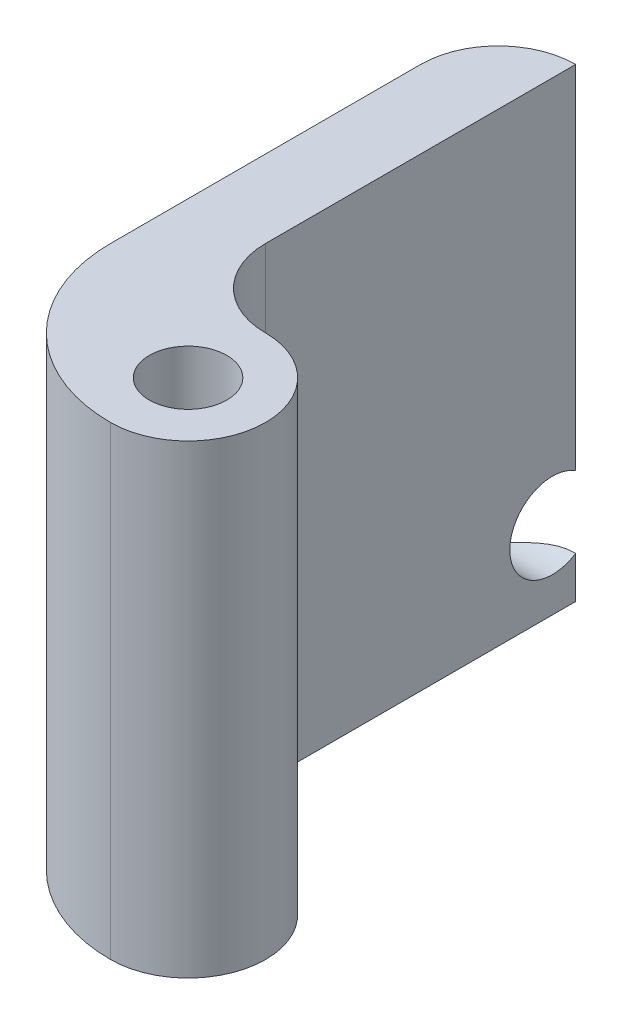
ISO-10303-21;
HEADER;
FILE_DESCRIPTION(('STEP AP214'),'2;1');
FILE_NAME('part.step','',(''),(''),'','','');
FILE_SCHEMA(('AUTOMOTIVE_DESIGN { 1 0 10303 214 1 1 1 1 }'));
ENDSEC;
DATA;
#1=APPLICATION_CONTEXT('core data for automotive mechanical design processes');
#2=APPLICATION_PROTOCOL_DEFINITION('international standard','automotive_design',2000,#1);
#3=PRODUCT_CONTEXT('',#1,'mechanical');
#4=PRODUCT('Part','Part','',(#3));
#5=PRODUCT_RELATED_PRODUCT_CATEGORY('part','',(#4));
#6=PRODUCT_DEFINITION_FORMATION('','',#4);
#7=PRODUCT_DEFINITION_CONTEXT('part definition',#1,'design');
#8=PRODUCT_DEFINITION('design','',#6,#7);
#9=PRODUCT_DEFINITION_SHAPE('','',#8);
#10=(LENGTH_UNIT() NAMED_UNIT(*) SI_UNIT(.MILLI.,.METRE.));
#11=(NAMED_UNIT(*) PLANE_ANGLE_UNIT() SI_UNIT($,.RADIAN.));
#12=(NAMED_UNIT(*) SI_UNIT($,.STERADIAN.) SOLID_ANGLE_UNIT());
#13=UNCERTAINTY_MEASURE_WITH_UNIT(LENGTH_MEASURE(1.E-05),#10,'distance_accuracy_value','');
#14=(GEOMETRIC_REPRESENTATION_CONTEXT(3) GLOBAL_UNCERTAINTY_ASSIGNED_CONTEXT((#13)) GLOBAL_UNIT_ASSIGNED_CONTEXT((#10,
#11,#12)) REPRESENTATION_CONTEXT('',''));
#15=CARTESIAN_POINT('',(0.,0.,0.));
#16=DIRECTION('',(0.,0.,1.));
#17=DIRECTION('',(1.,0.,0.));
#18=AXIS2_PLACEMENT_3D('',#15,#16,#17);
#19=CARTESIAN_POINT('',(0.,30.,-10.));
#20=DIRECTION('',(0.,-1.,0.));
#21=DIRECTION('',(0.,0.,-1.));
#22=AXIS2_PLACEMENT_3D('',#19,#20,#21);
#23=PLANE('',#22);
#24=DIRECTION('',(0.,0.,-1.));
#25=VECTOR('',#24,1.);
#26=CARTESIAN_POINT('',(-5.,30.,-30.));
#27=LINE('',#26,#25);
#28=CARTESIAN_POINT('',(-5.,30.,-10.));
#29=VERTEX_POINT('',#28);
#30=CARTESIAN_POINT('',(-5.,30.,-30.));
#31=VERTEX_POINT('',#30);
#32=EDGE_CURVE('E114',#29,#31,#27,.T.);
#33=ORIENTED_EDGE('',*,*,#32,.T.);
#34=CARTESIAN_POINT('',(-5.,30.,-25.));
#35=DIRECTION('',(0.,-1.,0.));
#36=DIRECTION('',(0.,0.,-1.));
#37=AXIS2_PLACEMENT_3D('',#34,#35,#36);
#38=CIRCLE('',#37,5.);
#39=CARTESIAN_POINT('',(-10.,30.,-25.));
#40=VERTEX_POINT('',#39);
#41=EDGE_CURVE('E49',#31,#40,#38,.F.);
#42=ORIENTED_EDGE('',*,*,#41,.T.);
#43=DIRECTION('',(0.,0.,1.));
#44=VECTOR('',#43,1.);
#45=CARTESIAN_POINT('',(-10.,30.,-5.00000000000001));
#46=LINE('',#45,#44);
#47=CARTESIAN_POINT('',(-10.,30.,-5.00000000000001));
#48=VERTEX_POINT('',#47);
#49=EDGE_CURVE('E141',#40,#48,#46,.T.);
#50=ORIENTED_EDGE('',*,*,#49,.T.);
#51=CARTESIAN_POINT('',(0.,30.,-5.00000000000001));
#52=DIRECTION('',(0.,1.,0.));
#53=DIRECTION('',(0.,0.,-1.));
#54=AXIS2_PLACEMENT_3D('',#51,#52,#53);
#55=CIRCLE('',#54,10.);
#56=CARTESIAN_POINT('',(0.,30.,4.99999999999999));
#57=VERTEX_POINT('',#56);
#58=EDGE_CURVE('E143',#48,#57,#55,.T.);
#59=ORIENTED_EDGE('',*,*,#58,.T.);
#60=CARTESIAN_POINT('',(0.,30.,0.));
#61=DIRECTION('',(0.,1.,0.));
#62=DIRECTION('',(0.,0.,1.));
#63=AXIS2_PLACEMENT_3D('',#60,#61,#62);
#64=CIRCLE('',#63,5.);
#65=CARTESIAN_POINT('',(0.,30.,-5.));
#66=VERTEX_POINT('',#65);
#67=EDGE_CURVE('E156',#57,#66,#64,.T.);
#68=ORIENTED_EDGE('',*,*,#67,.T.);
#69=CARTESIAN_POINT('',(0.,30.,-10.));
#70=DIRECTION('',(0.,-1.,0.));
#71=DIRECTION('',(0.,0.,-1.));
#72=AXIS2_PLACEMENT_3D('',#69,#70,#71);
#73=CIRCLE('',#72,5.);
#74=EDGE_CURVE('E154',#66,#29,#73,.T.);
#75=ORIENTED_EDGE('',*,*,#74,.T.);
#76=EDGE_LOOP('',(#33,#42,#50,#59,#68,#75));
#77=FACE_BOUND('',#76,.T.);
#78=CARTESIAN_POINT('',(0.,30.,0.));
#79=DIRECTION('',(0.,1.,0.));
#80=DIRECTION('',(0.,0.,1.));
#81=AXIS2_PLACEMENT_3D('',#78,#79,#80);
#82=CIRCLE('',#81,2.5);
#83=CARTESIAN_POINT('',(0.,30.,2.5));
#84=VERTEX_POINT('',#83);
#85=EDGE_CURVE('E152',#84,#84,#82,.T.);
#86=ORIENTED_EDGE('',*,*,#85,.F.);
#87=EDGE_LOOP('',(#86));
#88=FACE_BOUND('',#87,.T.);
#89=ADVANCED_FACE('F36',(#77,#88),#23,.F.);
#90=CARTESIAN_POINT('',(0.,0.,-10.));
#91=DIRECTION('',(0.,-1.,0.));
#92=DIRECTION('',(0.,0.,-1.));
#93=AXIS2_PLACEMENT_3D('',#90,#91,#92);
#94=PLANE('',#93);
#95=DIRECTION('',(0.,0.,1.));
#96=VECTOR('',#95,1.);
#97=CARTESIAN_POINT('',(-10.,0.,-5.00000000000001));
#98=LINE('',#97,#96);
#99=CARTESIAN_POINT('',(-10.,0.,-25.));
#100=VERTEX_POINT('',#99);
#101=CARTESIAN_POINT('',(-10.,0.,-5.00000000000001));
#102=VERTEX_POINT('',#101);
#103=EDGE_CURVE('E139',#100,#102,#98,.T.);
#104=ORIENTED_EDGE('',*,*,#103,.F.);
#105=CARTESIAN_POINT('',(-5.,0.,-25.));
#106=DIRECTION('',(0.,-1.,0.));
#107=DIRECTION('',(0.,0.,-1.));
#108=AXIS2_PLACEMENT_3D('',#105,#106,#107);
#109=CIRCLE('',#108,5.);
#110=CARTESIAN_POINT('',(-5.,0.,-30.));
#111=VERTEX_POINT('',#110);
#112=EDGE_CURVE('E130',#100,#111,#109,.T.);
#113=ORIENTED_EDGE('',*,*,#112,.T.);
#114=DIRECTION('',(0.,0.,-1.));
#115=VECTOR('',#114,1.);
#116=CARTESIAN_POINT('',(-5.,0.,-30.));
#117=LINE('',#116,#115);
#118=CARTESIAN_POINT('',(-5.,0.,-10.));
#119=VERTEX_POINT('',#118);
#120=EDGE_CURVE('E116',#119,#111,#117,.T.);
#121=ORIENTED_EDGE('',*,*,#120,.F.);
#122=CARTESIAN_POINT('',(0.,0.,-10.));
#123=DIRECTION('',(0.,-1.,0.));
#124=DIRECTION('',(0.,0.,-1.));
#125=AXIS2_PLACEMENT_3D('',#122,#123,#124);
#126=CIRCLE('',#125,5.);
#127=CARTESIAN_POINT('',(0.,0.,-5.));
#128=VERTEX_POINT('',#127);
#129=EDGE_CURVE('E142',#128,#119,#126,.T.);
#130=ORIENTED_EDGE('',*,*,#129,.F.);
#131=CARTESIAN_POINT('',(0.,0.,0.));
#132=DIRECTION('',(0.,1.,0.));
#133=DIRECTION('',(0.,0.,1.));
#134=AXIS2_PLACEMENT_3D('',#131,#132,#133);
#135=CIRCLE('',#134,5.);
#136=CARTESIAN_POINT('',(0.,0.,4.99999999999999));
#137=VERTEX_POINT('',#136);
#138=EDGE_CURVE('E145',#137,#128,#135,.T.);
#139=ORIENTED_EDGE('',*,*,#138,.F.);
#140=CARTESIAN_POINT('',(0.,0.,-5.00000000000001));
#141=DIRECTION('',(0.,1.,0.));
#142=DIRECTION('',(0.,0.,-1.));
#143=AXIS2_PLACEMENT_3D('',#140,#141,#142);
#144=CIRCLE('',#143,10.);
#145=EDGE_CURVE('E147',#102,#137,#144,.T.);
#146=ORIENTED_EDGE('',*,*,#145,.F.);
#147=EDGE_LOOP('',(#104,#113,#121,#130,#139,#146));
#148=FACE_BOUND('',#147,.T.);
#149=CARTESIAN_POINT('',(0.,0.,0.));
#150=DIRECTION('',(0.,1.,0.));
#151=DIRECTION('',(0.,0.,1.));
#152=AXIS2_PLACEMENT_3D('',#149,#150,#151);
#153=CIRCLE('',#152,2.5);
#154=CARTESIAN_POINT('',(0.,0.,2.5));
#155=VERTEX_POINT('',#154);
#156=EDGE_CURVE('E106',#155,#155,#153,.T.);
#157=ORIENTED_EDGE('',*,*,#156,.T.);
#158=EDGE_LOOP('',(#157));
#159=FACE_BOUND('',#158,.T.);
#160=ADVANCED_FACE('F135',(#148,#159),#94,.T.);
#161=CARTESIAN_POINT('',(-10.,30.,-5.00000000000001));
#162=DIRECTION('',(1.,0.,0.));
#163=DIRECTION('',(0.,0.,-1.));
#164=AXIS2_PLACEMENT_3D('',#161,#162,#163);
#165=PLANE('',#164);
#166=ORIENTED_EDGE('',*,*,#49,.F.);
#167=DIRECTION('',(0.,-1.,0.));
#168=VECTOR('',#167,1.);
#169=CARTESIAN_POINT('',(-10.,30.,-25.));
#170=LINE('',#169,#168);
#171=EDGE_CURVE('E127',#40,#100,#170,.T.);
#172=ORIENTED_EDGE('',*,*,#171,.T.);
#173=ORIENTED_EDGE('',*,*,#103,.T.);
#174=DIRECTION('',(0.,-1.,0.));
#175=VECTOR('',#174,1.);
#176=CARTESIAN_POINT('',(-10.,30.,-5.00000000000001));
#177=LINE('',#176,#175);
#178=EDGE_CURVE('E124',#48,#102,#177,.T.);
#179=ORIENTED_EDGE('',*,*,#178,.F.);
#180=EDGE_LOOP('',(#166,#172,#173,#179));
#181=FACE_BOUND('',#180,.T.);
#182=ADVANCED_FACE('F172',(#181),#165,.F.);
#183=CARTESIAN_POINT('',(0.,30.,-5.00000000000001));
#184=DIRECTION('',(0.,-1.,0.));
#185=DIRECTION('',(0.,0.,-1.));
#186=AXIS2_PLACEMENT_3D('',#183,#184,#185);
#187=CYLINDRICAL_SURFACE('',#186,10.);
#188=ORIENTED_EDGE('',*,*,#145,.T.);
#189=DIRECTION('',(0.,-1.,0.));
#190=VECTOR('',#189,1.);
#191=CARTESIAN_POINT('',(0.,30.,4.99999999999999));
#192=LINE('',#191,#190);
#193=EDGE_CURVE('E121',#57,#137,#192,.T.);
#194=ORIENTED_EDGE('',*,*,#193,.F.);
#195=ORIENTED_EDGE('',*,*,#58,.F.);
#196=ORIENTED_EDGE('',*,*,#178,.T.);
#197=EDGE_LOOP('',(#188,#194,#195,#196));
#198=FACE_BOUND('',#197,.T.);
#199=ADVANCED_FACE('F184',(#198),#187,.T.);
#200=CARTESIAN_POINT('',(0.,30.,0.));
#201=DIRECTION('',(0.,-1.,0.));
#202=DIRECTION('',(0.,0.,-1.));
#203=AXIS2_PLACEMENT_3D('',#200,#201,#202);
#204=CYLINDRICAL_SURFACE('',#203,5.);
#205=ORIENTED_EDGE('',*,*,#138,.T.);
#206=DIRECTION('',(0.,-1.,0.));
#207=VECTOR('',#206,1.);
#208=CARTESIAN_POINT('',(0.,30.,-5.));
#209=LINE('',#208,#207);
#210=EDGE_CURVE('E112',#66,#128,#209,.T.);
#211=ORIENTED_EDGE('',*,*,#210,.F.);
#212=ORIENTED_EDGE('',*,*,#67,.F.);
#213=ORIENTED_EDGE('',*,*,#193,.T.);
#214=EDGE_LOOP('',(#205,#211,#212,#213));
#215=FACE_BOUND('',#214,.T.);
#216=ADVANCED_FACE('F181',(#215),#204,.T.);
#217=CARTESIAN_POINT('',(0.,30.,-10.));
#218=DIRECTION('',(0.,-1.,0.));
#219=DIRECTION('',(0.,0.,-1.));
#220=AXIS2_PLACEMENT_3D('',#217,#218,#219);
#221=CYLINDRICAL_SURFACE('',#220,5.);
#222=ORIENTED_EDGE('',*,*,#129,.T.);
#223=DIRECTION('',(0.,-1.,0.));
#224=VECTOR('',#223,1.);
#225=CARTESIAN_POINT('',(-5.,30.,-10.));
#226=LINE('',#225,#224);
#227=EDGE_CURVE('E109',#29,#119,#226,.T.);
#228=ORIENTED_EDGE('',*,*,#227,.F.);
#229=ORIENTED_EDGE('',*,*,#74,.F.);
#230=ORIENTED_EDGE('',*,*,#210,.T.);
#231=EDGE_LOOP('',(#222,#228,#229,#230));
#232=FACE_BOUND('',#231,.T.);
#233=ADVANCED_FACE('F178',(#232),#221,.F.);
#234=CARTESIAN_POINT('',(-5.,30.,-30.));
#235=DIRECTION('',(-1.,0.,0.));
#236=DIRECTION('',(0.,0.,1.));
#237=AXIS2_PLACEMENT_3D('',#234,#235,#236);
#238=PLANE('',#237);
#239=DIRECTION('',(0.,-1.,0.));
#240=VECTOR('',#239,1.);
#241=CARTESIAN_POINT('',(-5.,30.,-30.));
#242=LINE('',#241,#240);
#243=CARTESIAN_POINT('',(-5.,2.69511388567689,-30.));
#244=VERTEX_POINT('',#243);
#245=EDGE_CURVE('E105',#244,#111,#242,.T.);
#246=ORIENTED_EDGE('',*,*,#245,.F.);
#247=CARTESIAN_POINT('',(-5.,5.00000000000006,-28.4999999999999));
#248=DIRECTION('',(-1.,0.,0.));
#249=DIRECTION('',(0.,0.,1.));
#250=AXIS2_PLACEMENT_3D('',#247,#248,#249);
#251=CIRCLE('',#250,2.75000000000004);
#252=CARTESIAN_POINT('',(-5.,7.30488611432323,-30.));
#253=VERTEX_POINT('',#252);
#254=EDGE_CURVE('E54',#244,#253,#251,.T.);
#255=ORIENTED_EDGE('',*,*,#254,.T.);
#256=EDGE_CURVE('E103',#31,#253,#242,.T.);
#257=ORIENTED_EDGE('',*,*,#256,.F.);
#258=ORIENTED_EDGE('',*,*,#32,.F.);
#259=ORIENTED_EDGE('',*,*,#227,.T.);
#260=ORIENTED_EDGE('',*,*,#120,.T.);
#261=EDGE_LOOP('',(#246,#255,#257,#258,#259,#260));
#262=FACE_BOUND('',#261,.T.);
#263=ADVANCED_FACE('F101',(#262),#238,.F.);
#264=CARTESIAN_POINT('',(0.,30.,0.));
#265=DIRECTION('',(0.,-1.,0.));
#266=DIRECTION('',(0.,0.,-1.));
#267=AXIS2_PLACEMENT_3D('',#264,#265,#266);
#268=CYLINDRICAL_SURFACE('',#267,2.5);
#269=ORIENTED_EDGE('',*,*,#85,.T.);
#270=EDGE_LOOP('',(#269));
#271=FACE_BOUND('',#270,.T.);
#272=ORIENTED_EDGE('',*,*,#156,.F.);
#273=EDGE_LOOP('',(#272));
#274=FACE_BOUND('',#273,.T.);
#275=ADVANCED_FACE('F164',(#271,#274),#268,.F.);
#276=CARTESIAN_POINT('',(-5.,30.,-25.));
#277=DIRECTION('',(0.,-1.,0.));
#278=DIRECTION('',(0.,0.,-1.));
#279=AXIS2_PLACEMENT_3D('',#276,#277,#278);
#280=CYLINDRICAL_SURFACE('',#279,5.);
#281=CARTESIAN_POINT('',(-5.,7.30488611432323,-30.));
#282=CARTESIAN_POINT('',(-4.88350079837599,7.30488438008612,-30.0000005848881));
#283=CARTESIAN_POINT('',(-4.76700903117045,7.30755376280442,-29.9959241485639));
#284=CARTESIAN_POINT('',(-4.53483204772067,7.31800684969586,-29.9796747868834));
#285=CARTESIAN_POINT('',(-4.41914679595078,7.32579032714486,-29.9675022204542));
#286=CARTESIAN_POINT('',(-4.18913322244802,7.3458727404168,-29.93518001819));
#287=CARTESIAN_POINT('',(-4.07480702488851,7.35817797655174,-29.9150192490528));
#288=CARTESIAN_POINT('',(-3.84823786206934,7.38638061181478,-29.8669160129058));
#289=CARTESIAN_POINT('',(-3.73599577735438,7.40227949350813,-29.8389703331073));
#290=CARTESIAN_POINT('',(-3.38865247107774,7.45596952601285,-29.7396163470483));
#291=CARTESIAN_POINT('',(-3.15795579994245,7.49820694558018,-29.6547660862543));
#292=CARTESIAN_POINT('',(-2.71145302390179,7.58218412325666,-29.4522760550566));
#293=CARTESIAN_POINT('',(-2.49564876297512,7.62392381921026,-29.334632233209));
#294=CARTESIAN_POINT('',(-2.10607961348294,7.69021560269432,-29.0831783344733));
#295=CARTESIAN_POINT('',(-1.93034824820065,7.71620548506325,-28.952859671417));
#296=CARTESIAN_POINT('',(-1.68007982976549,7.74040336113016,-28.7403385513366));
#297=CARTESIAN_POINT('',(-1.59890770478772,7.74600552698223,-28.6666898975731));
#298=CARTESIAN_POINT('',(-1.44147316087782,7.75102240406644,-28.5140970731862));
#299=CARTESIAN_POINT('',(-1.36520929038089,7.75043895316817,-28.4351544824234));
#300=CARTESIAN_POINT('',(-1.23573340242434,7.74282337548528,-28.2920013577872));
#301=CARTESIAN_POINT('',(-1.18135568259559,7.73735946215073,-28.2287575079397));
#302=CARTESIAN_POINT('',(-1.07611604866416,7.72152709757494,-28.1000066692595));
#303=CARTESIAN_POINT('',(-1.02525323848202,7.71115990168635,-28.0345002636698));
#304=CARTESIAN_POINT('',(-0.927330223383593,7.68499058352882,-27.9017516735269));
#305=CARTESIAN_POINT('',(-0.880269646745174,7.66918899334472,-27.8345096595041));
#306=CARTESIAN_POINT('',(-0.790234727850116,7.63169263625654,-27.6989795317148));
#307=CARTESIAN_POINT('',(-0.747258354832398,7.61000081902669,-27.6306919576457));
#308=CARTESIAN_POINT('',(-0.665233485896505,7.56014215233736,-27.493242474214));
#309=CARTESIAN_POINT('',(-0.626221521956598,7.53192177993822,-27.4240780692426));
#310=CARTESIAN_POINT('',(-0.552702452059029,7.46888777327927,-27.2864014971924));
#311=CARTESIAN_POINT('',(-0.518193215360937,7.43407727679335,-27.2178890359404));
#312=CARTESIAN_POINT('',(-0.453690499054868,7.35778630162598,-27.0824733131907));
#313=CARTESIAN_POINT('',(-0.423696655308705,7.31630636135197,-27.0155699222974));
#314=CARTESIAN_POINT('',(-0.368131502606649,7.22678281402705,-26.8843751193246));
#315=CARTESIAN_POINT('',(-0.342559684333782,7.17873996401684,-26.8200834070925));
#316=CARTESIAN_POINT('',(-0.298555295483646,7.08276053977785,-26.7028897604728));
#317=CARTESIAN_POINT('',(-0.279629933342807,7.03556047990159,-26.6495683195694));
#318=CARTESIAN_POINT('',(-0.244783652637904,6.93661909010059,-26.5462511548494));
#319=CARTESIAN_POINT('',(-0.22886374120248,6.88487624636532,-26.4962565494788));
#320=CARTESIAN_POINT('',(-0.185255350132327,6.72335885062642,-26.3521454799332));
#321=CARTESIAN_POINT('',(-0.161673897925519,6.60719515190793,-26.2637784392464));
#322=CARTESIAN_POINT('',(-0.123561702466859,6.36361389931764,-26.1075825983506));
#323=CARTESIAN_POINT('',(-0.108875285842824,6.23643730694591,-26.0394118922059));
#324=CARTESIAN_POINT('',(-0.085700937372615,5.97249669366126,-25.9236633932721));
#325=CARTESIAN_POINT('',(-0.0772136244224668,5.8357317169723,-25.876087656803));
#326=CARTESIAN_POINT('',(-0.064529334471971,5.55115292670175,-25.8016403871459));
#327=CARTESIAN_POINT('',(-0.0604995324806083,5.40311819700328,-25.7755843482168));
#328=CARTESIAN_POINT('',(-0.0562336979441752,5.10471686619894,-25.7479109681111));
#329=CARTESIAN_POINT('',(-0.0559982227697784,4.95434992574837,-25.7462972174061));
#330=CARTESIAN_POINT('',(-0.0592851180210162,4.65262815885907,-25.7677624589996));
#331=CARTESIAN_POINT('',(-0.06287686011923,4.50130624190038,-25.7912973140352));
#332=CARTESIAN_POINT('',(-0.0749175835935172,4.20481762830984,-25.8630610443448));
#333=CARTESIAN_POINT('',(-0.0833668271578029,4.05965126438393,-25.9112912525582));
#334=CARTESIAN_POINT('',(-0.107000816362275,3.78026003549509,-26.0306441792242));
#335=CARTESIAN_POINT('',(-0.122160495151609,3.64599663102872,-26.1016814331216));
#336=CARTESIAN_POINT('',(-0.161713056877911,3.39191797443834,-26.2640926197801));
#337=CARTESIAN_POINT('',(-0.186102869852574,3.27209793587219,-26.3554597866103));
#338=CARTESIAN_POINT('',(-0.245836268853506,3.05372394892031,-26.5518108325244));
#339=CARTESIAN_POINT('',(-0.280842425109099,2.95465491137525,-26.65632412098));
#340=CARTESIAN_POINT('',(-0.363891561036861,2.77605039178931,-26.8762383818068));
#341=CARTESIAN_POINT('',(-0.411930366224652,2.69650867047294,-26.9916358601583));
#342=CARTESIAN_POINT('',(-0.520403247999521,2.55994885180776,-27.2246942757542));
#343=CARTESIAN_POINT('',(-0.580458565362052,2.50236962702536,-27.3422048043939));
#344=CARTESIAN_POINT('',(-0.713489515790163,2.40618025049447,-27.5776183620988));
#345=CARTESIAN_POINT('',(-0.786467987654886,2.36757427360395,-27.6955214718063));
#346=CARTESIAN_POINT('',(-0.949033300909887,2.30575191891791,-27.9345880178184));
#347=CARTESIAN_POINT('',(-1.03935510175399,2.28360091247397,-28.0555209813898));
#348=CARTESIAN_POINT('',(-1.23164184273991,2.25550768554355,-28.2897537813862));
#349=CARTESIAN_POINT('',(-1.33361439699102,2.24957612879862,-28.4030485482429));
#350=CARTESIAN_POINT('',(-1.52400590605913,2.25037327616506,-28.596058678965));
#351=CARTESIAN_POINT('',(-1.61052000031012,2.25461957374823,-28.6777032621456));
#352=CARTESIAN_POINT('',(-1.78885854998942,2.26927383849586,-28.8344067269335));
#353=CARTESIAN_POINT('',(-1.88068549289879,2.27968471333388,-28.9094624815635));
#354=CARTESIAN_POINT('',(-2.16351777078853,2.31786058019475,-29.1243725640683));
#355=CARTESIAN_POINT('',(-2.3616506778843,2.35255957826099,-29.2537437375979));
#356=CARTESIAN_POINT('',(-2.77918136971558,2.42994824595884,-29.4863105727803));
#357=CARTESIAN_POINT('',(-2.9990451962319,2.47285049247009,-29.5885809089253));
#358=CARTESIAN_POINT('',(-3.45204792582144,2.55403858094329,-29.7604971327359));
#359=CARTESIAN_POINT('',(-3.68517735853006,2.5923276568706,-29.8301659749658));
#360=CARTESIAN_POINT('',(-4.06173418950196,2.64065742035693,-29.91323420193));
#361=CARTESIAN_POINT('',(-4.20206895908017,2.65582104901825,-29.9379840007137));
#362=CARTESIAN_POINT('',(-4.48495493492345,2.67921101792717,-29.9754459680692));
#363=CARTESIAN_POINT('',(-4.62750609827472,2.687437492322,-29.9881583694148));
#364=CARTESIAN_POINT('',(-4.91326434248702,2.69594149045814,-30.0012914766664));
#365=CARTESIAN_POINT('',(-5.05647058971365,2.69622724968873,-30.0017249173599));
#366=CARTESIAN_POINT('',(-5.34217543121717,2.68883706675379,-29.9903259907439));
#367=CARTESIAN_POINT('',(-5.484674069151,2.68116162205541,-29.9784943898328));
#368=CARTESIAN_POINT('',(-5.74568578286879,2.66051602932616,-29.945552053852));
#369=CARTESIAN_POINT('',(-5.86450099456769,2.64854795146736,-29.9261587580892));
#370=CARTESIAN_POINT('',(-6.09998535621392,2.62057654686118,-29.8789824132471));
#371=CARTESIAN_POINT('',(-6.21665359483854,2.60457154710889,-29.8511958848496));
#372=CARTESIAN_POINT('',(-6.56304395448154,2.55221119743616,-29.7554496136479));
#373=CARTESIAN_POINT('',(-6.78885250479127,2.51153953051289,-29.6751415725507));
#374=CARTESIAN_POINT('',(-7.13016470892409,2.44770704283925,-29.5255237325058));
#375=CARTESIAN_POINT('',(-7.25055851974997,2.42470048144652,-29.4668733332894));
#376=CARTESIAN_POINT('',(-7.48658474928433,2.3805400837121,-29.3399123256384));
#377=CARTESIAN_POINT('',(-7.60221621506978,2.35938661722089,-29.2715997958657));
#378=CARTESIAN_POINT('',(-7.82786067451209,2.32106299326783,-29.1256774454214));
#379=CARTESIAN_POINT('',(-7.93788391941865,2.30388534871914,-29.0480855243686));
#380=CARTESIAN_POINT('',(-8.15173850289651,2.27565427298037,-28.8839065793642));
#381=CARTESIAN_POINT('',(-8.25557312341884,2.26459756947624,-28.7973243911561));
#382=CARTESIAN_POINT('',(-8.4901237608452,2.24861691605481,-28.5849239873677));
#383=CARTESIAN_POINT('',(-8.61810773222439,2.24701498746497,-28.455715698513));
#384=CARTESIAN_POINT('',(-8.79837581210082,2.26029670233635,-28.2527778907979));
#385=CARTESIAN_POINT('',(-8.85650093048996,2.26733436384636,-28.183629287703));
#386=CARTESIAN_POINT('',(-8.96853797454876,2.28733450321601,-28.0428276610453));
#387=CARTESIAN_POINT('',(-9.02245050647017,2.30029612668663,-27.9711750000086));
#388=CARTESIAN_POINT('',(-9.16152932279025,2.34412470033377,-27.7756689163098));
#389=CARTESIAN_POINT('',(-9.24245352227166,2.38117522159842,-27.6500617764618));
#390=CARTESIAN_POINT('',(-9.38963889996948,2.47669447793009,-27.3984013958186));
#391=CARTESIAN_POINT('',(-9.45590623171927,2.53515419708595,-27.272348364896));
#392=CARTESIAN_POINT('',(-9.57360071346304,2.6746288520905,-27.0250932762636));
#393=CARTESIAN_POINT('',(-9.62497091904837,2.75572806961636,-26.9039113191311));
#394=CARTESIAN_POINT('',(-9.71341405170243,2.93930691752389,-26.6730379600809));
#395=CARTESIAN_POINT('',(-9.75048574055532,3.04178839837254,-26.5633475539015));
#396=CARTESIAN_POINT('',(-9.81037985241487,3.25792400724678,-26.3675042474904));
#397=CARTESIAN_POINT('',(-9.83398132208773,3.37039412159809,-26.2802756064079));
#398=CARTESIAN_POINT('',(-9.87274793648914,3.60848863942851,-26.1237641425535));
#399=CARTESIAN_POINT('',(-9.88791262428767,3.73411375493527,-26.0544822918754));
#400=CARTESIAN_POINT('',(-9.91221716994995,3.99801075520199,-25.9348539693848));
#401=CARTESIAN_POINT('',(-9.92121565707597,4.13650163890884,-25.8849624868192));
#402=CARTESIAN_POINT('',(-9.93445783382509,4.41988132176019,-25.8078753857724));
#403=CARTESIAN_POINT('',(-9.93870082629962,4.56477105573154,-25.7806830951084));
#404=CARTESIAN_POINT('',(-9.94356355269817,4.8616886532956,-25.7493011414502));
#405=CARTESIAN_POINT('',(-9.94406556948835,5.01379791742931,-25.7458590683874));
#406=CARTESIAN_POINT('',(-9.94128335384602,5.31648685551685,-25.7640669822267));
#407=CARTESIAN_POINT('',(-9.93799867103438,5.46706634537467,-25.7857199538626));
#408=CARTESIAN_POINT('',(-9.9266967907268,5.76356874626839,-25.8537261114412));
#409=CARTESIAN_POINT('',(-9.91864415637418,5.90944807410102,-25.9002639959749));
#410=CARTESIAN_POINT('',(-9.89591054555106,6.19105710633162,-26.0166387209612));
#411=CARTESIAN_POINT('',(-9.88123014654629,6.32678769377121,-26.0864735314544));
#412=CARTESIAN_POINT('',(-9.84301374999441,6.58207813976697,-26.2457106275731));
#413=CARTESIAN_POINT('',(-9.81961112931931,6.70184641379961,-26.3348101171877));
#414=CARTESIAN_POINT('',(-9.76139911555031,6.92389851675707,-26.5294948121177));
#415=CARTESIAN_POINT('',(-9.72659490300857,7.02619025445433,-26.6350725188243));
#416=CARTESIAN_POINT('',(-9.645052294535,7.20725150514631,-26.853802604887));
#417=CARTESIAN_POINT('',(-9.59879578484456,7.2867432131432,-26.9665379365785));
#418=CARTESIAN_POINT('',(-9.49288201418152,7.42587874510455,-27.1977621008113));
#419=CARTESIAN_POINT('',(-9.43322554008768,7.48552373400691,-27.3162505951926));
#420=CARTESIAN_POINT('',(-9.30055454421421,7.58546537596254,-27.5541791144859));
#421=CARTESIAN_POINT('',(-9.22751176335773,7.62572043113026,-27.6736206312117));
#422=CARTESIAN_POINT('',(-9.06915780990317,7.68850006693719,-27.9089660453673));
#423=CARTESIAN_POINT('',(-8.98384086589741,7.7110162741944,-28.0248682473288));
#424=CARTESIAN_POINT('',(-8.8289437496447,7.73659462873193,-28.217097307487));
#425=CARTESIAN_POINT('',(-8.76201495139185,7.74341234397966,-28.2951209015451));
#426=CARTESIAN_POINT('',(-8.62330099450508,7.75054190866076,-28.4470677921103));
#427=CARTESIAN_POINT('',(-8.55151416458086,7.75085150759911,-28.5209896614355));
#428=CARTESIAN_POINT('',(-8.32943340238077,7.74361419210714,-28.7359491470179));
#429=CARTESIAN_POINT('',(-8.17258218223245,7.72787999106658,-28.8699785206589));
#430=CARTESIAN_POINT('',(-7.78803664451986,7.67504792662399,-29.1597252531229));
#431=CARTESIAN_POINT('',(-7.55464519803223,7.63243165160715,-29.3068316376241));
#432=CARTESIAN_POINT('',(-7.18993864894994,7.56379009728796,-29.4970051928016));
#433=CARTESIAN_POINT('',(-7.06580193558641,7.54009736285676,-29.5553583658307));
#434=CARTESIAN_POINT('',(-6.81301681472807,7.49324226778291,-29.6617325581889));
#435=CARTESIAN_POINT('',(-6.68436835146279,7.47007991370223,-29.7097534497467));
#436=CARTESIAN_POINT('',(-6.42932688489796,7.42742352664261,-29.7931378713083));
#437=CARTESIAN_POINT('',(-6.30311432160136,7.40780790758013,-29.8289920836364));
#438=CARTESIAN_POINT('',(-6.04776596357154,7.37267426440386,-29.8907487513108));
#439=CARTESIAN_POINT('',(-5.91863174766599,7.35715408199446,-29.9166564517582));
#440=CARTESIAN_POINT('',(-5.65848701258648,7.33168666602341,-29.9581952702188));
#441=CARTESIAN_POINT('',(-5.52748181511647,7.32172598236288,-29.9738512063817));
#442=CARTESIAN_POINT('',(-5.26431443602425,7.30832718979804,-29.9947524420314));
#443=CARTESIAN_POINT('',(-5.13215243478011,7.30488808157839,-29.9999993365243));
#444=CARTESIAN_POINT('',(-5.,7.30488611432323,-30.));
#445=B_SPLINE_CURVE_WITH_KNOTS('',3,(#281,#282,#283,#284,#285,#286,#287,#288,#289,#290,#291,
#292,#293,#294,#295,#296,#297,#298,#299,#300,#301,#302,#303,#304,#305,#306,#307,#308,#309,#310,
#311,#312,#313,#314,#315,#316,#317,#318,#319,#320,#321,#322,#323,#324,#325,#326,#327,#328,#329,
#330,#331,#332,#333,#334,#335,#336,#337,#338,#339,#340,#341,#342,#343,#344,#345,#346,#347,#348,
#349,#350,#351,#352,#353,#354,#355,#356,#357,#358,#359,#360,#361,#362,#363,#364,#365,#366,#367,
#368,#369,#370,#371,#372,#373,#374,#375,#376,#377,#378,#379,#380,#381,#382,#383,#384,#385,#386,
#387,#388,#389,#390,#391,#392,#393,#394,#395,#396,#397,#398,#399,#400,#401,#402,#403,#404,#405,
#406,#407,#408,#409,#410,#411,#412,#413,#414,#415,#416,#417,#418,#419,#420,#421,#422,#423,#424,
#425,#426,#427,#428,#429,#430,#431,#432,#433,#434,#435,#436,#437,#438,#439,#440,#441,#442,#443,
#444),.UNSPECIFIED.,.T.,.F.,(4,2,2,2,2,2,2,2,2,2,2,2,2,2,2,2,2,2,2,2,2,2,2,2,2,2,2,2,2,2,2,2,2,
2,2,2,2,2,2,2,2,2,2,2,2,2,2,2,2,2,2,2,2,2,2,2,2,2,2,2,2,2,2,2,2,2,2,2,2,2,2,2,2,2,2,2,2,2,2,2,2,
4),(0.,0.349384378223677,0.698753268167686,1.04861080231487,1.39861293514113,2.14388578409714,
2.88925074779832,3.54758662988745,3.87649652626889,4.20530869972668,4.45584501986212,
4.70631723165415,4.95676492653818,5.20708743421741,5.4595398313598,5.71187232858941,
5.96418446586888,6.21646752313261,6.43723365600382,6.65807363695385,7.0992651440094,
7.53249363015664,7.96576536235476,8.41478712412406,8.86387484470312,9.321243376839,
9.77863659818982,10.2343354580429,10.6898828845017,11.1322467487441,11.5744690864856,
12.004484450922,12.4345943932712,12.8905756563229,13.3468566396876,13.7034707994596,
14.060253299157,14.7747611355473,15.5112003050941,16.2471201680541,16.6764446448663,
17.1057608194258,17.5346317241603,17.9634758319017,18.3260174524982,18.6887095672997,
19.4149938617811,19.8223102391596,20.2297077265537,20.6363316635429,21.042738005009,
21.5860908564373,21.8576330042316,22.1291360009552,22.5888498683934,23.0483703618319,
23.5096248972573,23.9709193672102,24.4017644872888,24.8326329393577,25.2730760460973,
25.7135837127095,26.1678965228807,26.622263373282,27.080050370526,27.5377974892718,
27.9888143805066,28.4396266263456,28.8739866970059,29.3083212676431,29.7435835261883,
30.1790511214663,30.4877200000268,30.7964956139795,31.4148181649931,32.2476844441634,
32.6649518422962,33.0822244001588,33.4797894813672,33.877144625393,34.2735342341254,
34.6698630982957),.UNSPECIFIED.);
#446=EDGE_CURVE('E11',#244,#253,#445,.T.);
#447=ORIENTED_EDGE('',*,*,#446,.F.);
#448=ORIENTED_EDGE('',*,*,#245,.T.);
#449=ORIENTED_EDGE('',*,*,#112,.F.);
#450=ORIENTED_EDGE('',*,*,#171,.F.);
#451=ORIENTED_EDGE('',*,*,#41,.F.);
#452=ORIENTED_EDGE('',*,*,#256,.T.);
#453=EDGE_LOOP('',(#447,#448,#449,#450,#451,#452));
#454=FACE_BOUND('',#453,.T.);
#455=ADVANCED_FACE('F38',(#454),#280,.T.);
#456=CARTESIAN_POINT('',(-119.,5.00000000000006,-28.4999999999998));
#457=DIRECTION('',(1.,0.,0.));
#458=DIRECTION('',(0.,0.,-1.));
#459=AXIS2_PLACEMENT_3D('',#456,#457,#458);
#460=CYLINDRICAL_SURFACE('',#459,2.75000000000004);
#461=ORIENTED_EDGE('',*,*,#446,.T.);
#462=ORIENTED_EDGE('',*,*,#254,.F.);
#463=EDGE_LOOP('',(#461,#462));
#464=FACE_BOUND('',#463,.T.);
#465=ADVANCED_FACE('F95',(#464),#460,.F.);
#466=CLOSED_SHELL('',(#89,#160,#182,#199,#216,#233,#263,#275,#455,#465));
#467=MANIFOLD_SOLID_BREP('B2',#466);
#468=ADVANCED_BREP_SHAPE_REPRESENTATION('',(#18,#467),#14);
#469=SHAPE_DEFINITION_REPRESENTATION(#9,#468);
ENDSEC;
END-ISO-10303-21;
